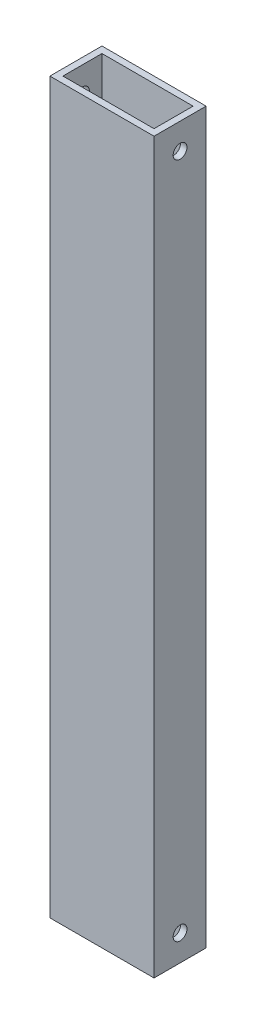
ISO-10303-21;
HEADER;
FILE_DESCRIPTION(('STEP AP214'),'2;1');
FILE_NAME('part.step','',(''),(''),'','','');
FILE_SCHEMA(('AUTOMOTIVE_DESIGN { 1 0 10303 214 1 1 1 1 }'));
ENDSEC;
DATA;
#1=APPLICATION_CONTEXT('core data for automotive mechanical design processes');
#2=APPLICATION_PROTOCOL_DEFINITION('international standard','automotive_design',2000,#1);
#3=PRODUCT_CONTEXT('',#1,'mechanical');
#4=PRODUCT('Part','Part','',(#3));
#5=PRODUCT_RELATED_PRODUCT_CATEGORY('part','',(#4));
#6=PRODUCT_DEFINITION_FORMATION('','',#4);
#7=PRODUCT_DEFINITION_CONTEXT('part definition',#1,'design');
#8=PRODUCT_DEFINITION('design','',#6,#7);
#9=PRODUCT_DEFINITION_SHAPE('','',#8);
#10=(LENGTH_UNIT() NAMED_UNIT(*) SI_UNIT(.MILLI.,.METRE.));
#11=(NAMED_UNIT(*) PLANE_ANGLE_UNIT() SI_UNIT($,.RADIAN.));
#12=(NAMED_UNIT(*) SI_UNIT($,.STERADIAN.) SOLID_ANGLE_UNIT());
#13=UNCERTAINTY_MEASURE_WITH_UNIT(LENGTH_MEASURE(1.E-05),#10,'distance_accuracy_value','');
#14=(GEOMETRIC_REPRESENTATION_CONTEXT(3) GLOBAL_UNCERTAINTY_ASSIGNED_CONTEXT((#13)) GLOBAL_UNIT_ASSIGNED_CONTEXT((#10,
#11,#12)) REPRESENTATION_CONTEXT('',''));
#15=CARTESIAN_POINT('',(0.,0.,0.));
#16=DIRECTION('',(0.,0.,1.));
#17=DIRECTION('',(1.,0.,0.));
#18=AXIS2_PLACEMENT_3D('',#15,#16,#17);
#19=CARTESIAN_POINT('',(0.,355.6,0.));
#20=DIRECTION('',(0.,-1.,0.));
#21=DIRECTION('',(0.,0.,-1.));
#22=AXIS2_PLACEMENT_3D('',#19,#20,#21);
#23=PLANE('',#22);
#24=DIRECTION('',(0.,0.,1.));
#25=VECTOR('',#24,1.);
#26=CARTESIAN_POINT('',(0.,355.6,0.));
#27=LINE('',#26,#25);
#28=CARTESIAN_POINT('',(0.,355.6,-25.4));
#29=VERTEX_POINT('',#28);
#30=CARTESIAN_POINT('',(0.,355.6,0.));
#31=VERTEX_POINT('',#30);
#32=EDGE_CURVE('E137',#29,#31,#27,.T.);
#33=ORIENTED_EDGE('',*,*,#32,.T.);
#34=DIRECTION('',(1.,0.,0.));
#35=VECTOR('',#34,1.);
#36=CARTESIAN_POINT('',(0.,355.6,0.));
#37=LINE('',#36,#35);
#38=CARTESIAN_POINT('',(50.8,355.6,0.));
#39=VERTEX_POINT('',#38);
#40=EDGE_CURVE('E140',#31,#39,#37,.T.);
#41=ORIENTED_EDGE('',*,*,#40,.T.);
#42=DIRECTION('',(0.,0.,-1.));
#43=VECTOR('',#42,1.);
#44=CARTESIAN_POINT('',(50.8,355.6,0.));
#45=LINE('',#44,#43);
#46=CARTESIAN_POINT('',(50.8,355.6,-25.4));
#47=VERTEX_POINT('',#46);
#48=EDGE_CURVE('E143',#39,#47,#45,.T.);
#49=ORIENTED_EDGE('',*,*,#48,.T.);
#50=DIRECTION('',(-1.,0.,0.));
#51=VECTOR('',#50,1.);
#52=CARTESIAN_POINT('',(0.,355.6,-25.4));
#53=LINE('',#52,#51);
#54=EDGE_CURVE('E145',#47,#29,#53,.T.);
#55=ORIENTED_EDGE('',*,*,#54,.T.);
#56=EDGE_LOOP('',(#33,#41,#49,#55));
#57=FACE_BOUND('',#56,.T.);
#58=DIRECTION('',(1.,0.,0.));
#59=VECTOR('',#58,1.);
#60=CARTESIAN_POINT('',(3.175,355.6,-3.175));
#61=LINE('',#60,#59);
#62=CARTESIAN_POINT('',(3.175,355.6,-3.175));
#63=VERTEX_POINT('',#62);
#64=CARTESIAN_POINT('',(47.625,355.6,-3.175));
#65=VERTEX_POINT('',#64);
#66=EDGE_CURVE('E99',#63,#65,#61,.T.);
#67=ORIENTED_EDGE('',*,*,#66,.F.);
#68=DIRECTION('',(0.,0.,1.));
#69=VECTOR('',#68,1.);
#70=CARTESIAN_POINT('',(3.175,355.6,-3.175));
#71=LINE('',#70,#69);
#72=CARTESIAN_POINT('',(3.175,355.6,-22.225));
#73=VERTEX_POINT('',#72);
#74=EDGE_CURVE('E121',#73,#63,#71,.T.);
#75=ORIENTED_EDGE('',*,*,#74,.F.);
#76=DIRECTION('',(-1.,0.,0.));
#77=VECTOR('',#76,1.);
#78=CARTESIAN_POINT('',(3.175,355.6,-22.225));
#79=LINE('',#78,#77);
#80=CARTESIAN_POINT('',(47.625,355.6,-22.225));
#81=VERTEX_POINT('',#80);
#82=EDGE_CURVE('E119',#81,#73,#79,.T.);
#83=ORIENTED_EDGE('',*,*,#82,.F.);
#84=DIRECTION('',(0.,0.,-1.));
#85=VECTOR('',#84,1.);
#86=CARTESIAN_POINT('',(47.625,355.6,-3.175));
#87=LINE('',#86,#85);
#88=EDGE_CURVE('E107',#65,#81,#87,.T.);
#89=ORIENTED_EDGE('',*,*,#88,.F.);
#90=EDGE_LOOP('',(#67,#75,#83,#89));
#91=FACE_BOUND('',#90,.T.);
#92=ADVANCED_FACE('F32',(#57,#91),#23,.F.);
#93=CARTESIAN_POINT('',(0.,0.,0.));
#94=DIRECTION('',(0.,-1.,0.));
#95=DIRECTION('',(0.,0.,-1.));
#96=AXIS2_PLACEMENT_3D('',#93,#94,#95);
#97=PLANE('',#96);
#98=DIRECTION('',(0.,0.,1.));
#99=VECTOR('',#98,1.);
#100=CARTESIAN_POINT('',(0.,0.,0.));
#101=LINE('',#100,#99);
#102=CARTESIAN_POINT('',(0.,0.,-25.4));
#103=VERTEX_POINT('',#102);
#104=CARTESIAN_POINT('',(0.,0.,0.));
#105=VERTEX_POINT('',#104);
#106=EDGE_CURVE('E115',#103,#105,#101,.T.);
#107=ORIENTED_EDGE('',*,*,#106,.F.);
#108=DIRECTION('',(-1.,0.,0.));
#109=VECTOR('',#108,1.);
#110=CARTESIAN_POINT('',(0.,0.,-25.4));
#111=LINE('',#110,#109);
#112=CARTESIAN_POINT('',(50.8,0.,-25.4));
#113=VERTEX_POINT('',#112);
#114=EDGE_CURVE('E141',#113,#103,#111,.T.);
#115=ORIENTED_EDGE('',*,*,#114,.F.);
#116=DIRECTION('',(0.,0.,-1.));
#117=VECTOR('',#116,1.);
#118=CARTESIAN_POINT('',(50.8,0.,0.));
#119=LINE('',#118,#117);
#120=CARTESIAN_POINT('',(50.8,0.,0.));
#121=VERTEX_POINT('',#120);
#122=EDGE_CURVE('E152',#121,#113,#119,.T.);
#123=ORIENTED_EDGE('',*,*,#122,.F.);
#124=DIRECTION('',(1.,0.,0.));
#125=VECTOR('',#124,1.);
#126=CARTESIAN_POINT('',(0.,0.,0.));
#127=LINE('',#126,#125);
#128=EDGE_CURVE('E150',#105,#121,#127,.T.);
#129=ORIENTED_EDGE('',*,*,#128,.F.);
#130=EDGE_LOOP('',(#107,#115,#123,#129));
#131=FACE_BOUND('',#130,.T.);
#132=DIRECTION('',(0.,0.,1.));
#133=VECTOR('',#132,1.);
#134=CARTESIAN_POINT('',(3.175,0.,-3.175));
#135=LINE('',#134,#133);
#136=CARTESIAN_POINT('',(3.175,0.,-22.225));
#137=VERTEX_POINT('',#136);
#138=CARTESIAN_POINT('',(3.175,0.,-3.175));
#139=VERTEX_POINT('',#138);
#140=EDGE_CURVE('E108',#137,#139,#135,.T.);
#141=ORIENTED_EDGE('',*,*,#140,.T.);
#142=DIRECTION('',(1.,0.,0.));
#143=VECTOR('',#142,1.);
#144=CARTESIAN_POINT('',(3.175,0.,-3.175));
#145=LINE('',#144,#143);
#146=CARTESIAN_POINT('',(47.625,0.,-3.175));
#147=VERTEX_POINT('',#146);
#148=EDGE_CURVE('E57',#139,#147,#145,.T.);
#149=ORIENTED_EDGE('',*,*,#148,.T.);
#150=DIRECTION('',(0.,0.,-1.));
#151=VECTOR('',#150,1.);
#152=CARTESIAN_POINT('',(47.625,0.,-3.175));
#153=LINE('',#152,#151);
#154=CARTESIAN_POINT('',(47.625,0.,-22.225));
#155=VERTEX_POINT('',#154);
#156=EDGE_CURVE('E114',#147,#155,#153,.T.);
#157=ORIENTED_EDGE('',*,*,#156,.T.);
#158=DIRECTION('',(-1.,0.,0.));
#159=VECTOR('',#158,1.);
#160=CARTESIAN_POINT('',(3.175,0.,-22.225));
#161=LINE('',#160,#159);
#162=EDGE_CURVE('E129',#155,#137,#161,.T.);
#163=ORIENTED_EDGE('',*,*,#162,.T.);
#164=EDGE_LOOP('',(#141,#149,#157,#163));
#165=FACE_BOUND('',#164,.T.);
#166=ADVANCED_FACE('F205',(#131,#165),#97,.T.);
#167=CARTESIAN_POINT('',(0.,355.6,0.));
#168=DIRECTION('',(1.,0.,0.));
#169=DIRECTION('',(0.,0.,-1.));
#170=AXIS2_PLACEMENT_3D('',#167,#168,#169);
#171=PLANE('',#170);
#172=CARTESIAN_POINT('',(0.,342.9,-12.6999999999999));
#173=DIRECTION('',(-1.,0.,0.));
#174=DIRECTION('',(0.,0.,-1.));
#175=AXIS2_PLACEMENT_3D('',#172,#173,#174);
#176=CIRCLE('',#175,3.3734375);
#177=CARTESIAN_POINT('',(0.,342.9,-16.0734374999999));
#178=VERTEX_POINT('',#177);
#179=EDGE_CURVE('E181',#178,#178,#176,.T.);
#180=ORIENTED_EDGE('',*,*,#179,.F.);
#181=EDGE_LOOP('',(#180));
#182=FACE_BOUND('',#181,.T.);
#183=CARTESIAN_POINT('',(0.,12.7,-12.6999999999999));
#184=DIRECTION('',(1.,0.,0.));
#185=DIRECTION('',(0.,0.,-1.));
#186=AXIS2_PLACEMENT_3D('',#183,#184,#185);
#187=CIRCLE('',#186,3.3734375);
#188=CARTESIAN_POINT('',(0.,12.7,-16.0734374999999));
#189=VERTEX_POINT('',#188);
#190=EDGE_CURVE('E163',#189,#189,#187,.T.);
#191=ORIENTED_EDGE('',*,*,#190,.T.);
#192=EDGE_LOOP('',(#191));
#193=FACE_BOUND('',#192,.T.);
#194=ORIENTED_EDGE('',*,*,#106,.T.);
#195=DIRECTION('',(0.,-1.,0.));
#196=VECTOR('',#195,1.);
#197=CARTESIAN_POINT('',(0.,355.6,0.));
#198=LINE('',#197,#196);
#199=EDGE_CURVE('E11',#31,#105,#198,.T.);
#200=ORIENTED_EDGE('',*,*,#199,.F.);
#201=ORIENTED_EDGE('',*,*,#32,.F.);
#202=DIRECTION('',(0.,-1.,0.));
#203=VECTOR('',#202,1.);
#204=CARTESIAN_POINT('',(0.,355.6,-25.4));
#205=LINE('',#204,#203);
#206=EDGE_CURVE('E147',#29,#103,#205,.T.);
#207=ORIENTED_EDGE('',*,*,#206,.T.);
#208=EDGE_LOOP('',(#194,#200,#201,#207));
#209=FACE_BOUND('',#208,.T.);
#210=ADVANCED_FACE('F34',(#182,#193,#209),#171,.F.);
#211=CARTESIAN_POINT('',(0.,355.6,0.));
#212=DIRECTION('',(0.,0.,-1.));
#213=DIRECTION('',(-1.,0.,0.));
#214=AXIS2_PLACEMENT_3D('',#211,#212,#213);
#215=PLANE('',#214);
#216=ORIENTED_EDGE('',*,*,#128,.T.);
#217=DIRECTION('',(0.,-1.,0.));
#218=VECTOR('',#217,1.);
#219=CARTESIAN_POINT('',(50.8,355.6,0.));
#220=LINE('',#219,#218);
#221=EDGE_CURVE('E41',#39,#121,#220,.T.);
#222=ORIENTED_EDGE('',*,*,#221,.F.);
#223=ORIENTED_EDGE('',*,*,#40,.F.);
#224=ORIENTED_EDGE('',*,*,#199,.T.);
#225=EDGE_LOOP('',(#216,#222,#223,#224));
#226=FACE_BOUND('',#225,.T.);
#227=ADVANCED_FACE('F222',(#226),#215,.F.);
#228=CARTESIAN_POINT('',(50.8,355.6,0.));
#229=DIRECTION('',(-1.,0.,0.));
#230=DIRECTION('',(0.,0.,1.));
#231=AXIS2_PLACEMENT_3D('',#228,#229,#230);
#232=PLANE('',#231);
#233=CARTESIAN_POINT('',(50.8,342.9,-12.7));
#234=DIRECTION('',(-1.,0.,0.));
#235=DIRECTION('',(0.,0.,-1.));
#236=AXIS2_PLACEMENT_3D('',#233,#234,#235);
#237=CIRCLE('',#236,3.3734375);
#238=CARTESIAN_POINT('',(50.8,342.9,-16.0734375));
#239=VERTEX_POINT('',#238);
#240=EDGE_CURVE('E178',#239,#239,#237,.T.);
#241=ORIENTED_EDGE('',*,*,#240,.T.);
#242=EDGE_LOOP('',(#241));
#243=FACE_BOUND('',#242,.T.);
#244=CARTESIAN_POINT('',(50.8,12.7,-12.7));
#245=DIRECTION('',(1.,0.,0.));
#246=DIRECTION('',(0.,0.,-1.));
#247=AXIS2_PLACEMENT_3D('',#244,#245,#246);
#248=CIRCLE('',#247,3.3734375);
#249=CARTESIAN_POINT('',(50.8,12.7,-16.0734375));
#250=VERTEX_POINT('',#249);
#251=EDGE_CURVE('E168',#250,#250,#248,.T.);
#252=ORIENTED_EDGE('',*,*,#251,.F.);
#253=EDGE_LOOP('',(#252));
#254=FACE_BOUND('',#253,.T.);
#255=ORIENTED_EDGE('',*,*,#122,.T.);
#256=DIRECTION('',(0.,-1.,0.));
#257=VECTOR('',#256,1.);
#258=CARTESIAN_POINT('',(50.8,355.6,-25.4));
#259=LINE('',#258,#257);
#260=EDGE_CURVE('E157',#47,#113,#259,.T.);
#261=ORIENTED_EDGE('',*,*,#260,.F.);
#262=ORIENTED_EDGE('',*,*,#48,.F.);
#263=ORIENTED_EDGE('',*,*,#221,.T.);
#264=EDGE_LOOP('',(#255,#261,#262,#263));
#265=FACE_BOUND('',#264,.T.);
#266=ADVANCED_FACE('F219',(#243,#254,#265),#232,.F.);
#267=CARTESIAN_POINT('',(0.,355.6,-25.4));
#268=DIRECTION('',(0.,0.,1.));
#269=DIRECTION('',(1.,0.,0.));
#270=AXIS2_PLACEMENT_3D('',#267,#268,#269);
#271=PLANE('',#270);
#272=ORIENTED_EDGE('',*,*,#114,.T.);
#273=ORIENTED_EDGE('',*,*,#206,.F.);
#274=ORIENTED_EDGE('',*,*,#54,.F.);
#275=ORIENTED_EDGE('',*,*,#260,.T.);
#276=EDGE_LOOP('',(#272,#273,#274,#275));
#277=FACE_BOUND('',#276,.T.);
#278=ADVANCED_FACE('F216',(#277),#271,.F.);
#279=CARTESIAN_POINT('',(3.175,355.6,-3.175));
#280=DIRECTION('',(0.,0.,-1.));
#281=DIRECTION('',(-1.,0.,0.));
#282=AXIS2_PLACEMENT_3D('',#279,#280,#281);
#283=PLANE('',#282);
#284=ORIENTED_EDGE('',*,*,#148,.F.);
#285=DIRECTION('',(0.,-1.,0.));
#286=VECTOR('',#285,1.);
#287=CARTESIAN_POINT('',(3.175,355.6,-3.175));
#288=LINE('',#287,#286);
#289=EDGE_CURVE('E103',#63,#139,#288,.T.);
#290=ORIENTED_EDGE('',*,*,#289,.F.);
#291=ORIENTED_EDGE('',*,*,#66,.T.);
#292=DIRECTION('',(0.,-1.,0.));
#293=VECTOR('',#292,1.);
#294=CARTESIAN_POINT('',(47.625,355.6,-3.175));
#295=LINE('',#294,#293);
#296=EDGE_CURVE('E102',#65,#147,#295,.T.);
#297=ORIENTED_EDGE('',*,*,#296,.T.);
#298=EDGE_LOOP('',(#284,#290,#291,#297));
#299=FACE_BOUND('',#298,.T.);
#300=ADVANCED_FACE('F101',(#299),#283,.T.);
#301=CARTESIAN_POINT('',(47.625,355.6,-3.175));
#302=DIRECTION('',(-1.,0.,0.));
#303=DIRECTION('',(0.,0.,1.));
#304=AXIS2_PLACEMENT_3D('',#301,#302,#303);
#305=PLANE('',#304);
#306=CARTESIAN_POINT('',(47.625,342.9,-12.7));
#307=DIRECTION('',(-1.,0.,0.));
#308=DIRECTION('',(0.,0.,1.));
#309=AXIS2_PLACEMENT_3D('',#306,#307,#308);
#310=CIRCLE('',#309,3.3734375);
#311=CARTESIAN_POINT('',(47.625,342.9,-9.32656249999997));
#312=VERTEX_POINT('',#311);
#313=EDGE_CURVE('E173',#312,#312,#310,.F.);
#314=ORIENTED_EDGE('',*,*,#313,.T.);
#315=EDGE_LOOP('',(#314));
#316=FACE_BOUND('',#315,.T.);
#317=CARTESIAN_POINT('',(47.625,12.7,-12.7));
#318=DIRECTION('',(-1.,0.,0.));
#319=DIRECTION('',(0.,0.,1.));
#320=AXIS2_PLACEMENT_3D('',#317,#318,#319);
#321=CIRCLE('',#320,3.3734375);
#322=CARTESIAN_POINT('',(47.625,12.7,-9.32656249999997));
#323=VERTEX_POINT('',#322);
#324=EDGE_CURVE('E127',#323,#323,#321,.T.);
#325=ORIENTED_EDGE('',*,*,#324,.F.);
#326=EDGE_LOOP('',(#325));
#327=FACE_BOUND('',#326,.T.);
#328=ORIENTED_EDGE('',*,*,#156,.F.);
#329=ORIENTED_EDGE('',*,*,#296,.F.);
#330=ORIENTED_EDGE('',*,*,#88,.T.);
#331=DIRECTION('',(0.,-1.,0.));
#332=VECTOR('',#331,1.);
#333=CARTESIAN_POINT('',(47.625,355.6,-22.225));
#334=LINE('',#333,#332);
#335=EDGE_CURVE('E116',#81,#155,#334,.T.);
#336=ORIENTED_EDGE('',*,*,#335,.T.);
#337=EDGE_LOOP('',(#328,#329,#330,#336));
#338=FACE_BOUND('',#337,.T.);
#339=ADVANCED_FACE('F111',(#316,#327,#338),#305,.T.);
#340=CARTESIAN_POINT('',(3.175,355.6,-22.225));
#341=DIRECTION('',(0.,0.,1.));
#342=DIRECTION('',(1.,0.,0.));
#343=AXIS2_PLACEMENT_3D('',#340,#341,#342);
#344=PLANE('',#343);
#345=ORIENTED_EDGE('',*,*,#162,.F.);
#346=ORIENTED_EDGE('',*,*,#335,.F.);
#347=ORIENTED_EDGE('',*,*,#82,.T.);
#348=DIRECTION('',(0.,-1.,0.));
#349=VECTOR('',#348,1.);
#350=CARTESIAN_POINT('',(3.175,355.6,-22.225));
#351=LINE('',#350,#349);
#352=EDGE_CURVE('E49',#73,#137,#351,.T.);
#353=ORIENTED_EDGE('',*,*,#352,.T.);
#354=EDGE_LOOP('',(#345,#346,#347,#353));
#355=FACE_BOUND('',#354,.T.);
#356=ADVANCED_FACE('F245',(#355),#344,.T.);
#357=CARTESIAN_POINT('',(3.175,355.6,-3.175));
#358=DIRECTION('',(1.,0.,0.));
#359=DIRECTION('',(0.,0.,-1.));
#360=AXIS2_PLACEMENT_3D('',#357,#358,#359);
#361=PLANE('',#360);
#362=CARTESIAN_POINT('',(3.175,342.9,-12.6999999999999));
#363=DIRECTION('',(1.,0.,0.));
#364=DIRECTION('',(0.,0.,-1.));
#365=AXIS2_PLACEMENT_3D('',#362,#363,#364);
#366=CIRCLE('',#365,3.3734375);
#367=CARTESIAN_POINT('',(3.175,342.9,-16.0734374999999));
#368=VERTEX_POINT('',#367);
#369=EDGE_CURVE('E36',#368,#368,#366,.F.);
#370=ORIENTED_EDGE('',*,*,#369,.T.);
#371=EDGE_LOOP('',(#370));
#372=FACE_BOUND('',#371,.T.);
#373=CARTESIAN_POINT('',(3.175,12.7,-12.6999999999999));
#374=DIRECTION('',(1.,0.,0.));
#375=DIRECTION('',(0.,0.,-1.));
#376=AXIS2_PLACEMENT_3D('',#373,#374,#375);
#377=CIRCLE('',#376,3.3734375);
#378=CARTESIAN_POINT('',(3.175,12.7,-16.0734374999999));
#379=VERTEX_POINT('',#378);
#380=EDGE_CURVE('E161',#379,#379,#377,.T.);
#381=ORIENTED_EDGE('',*,*,#380,.F.);
#382=EDGE_LOOP('',(#381));
#383=FACE_BOUND('',#382,.T.);
#384=ORIENTED_EDGE('',*,*,#140,.F.);
#385=ORIENTED_EDGE('',*,*,#352,.F.);
#386=ORIENTED_EDGE('',*,*,#74,.T.);
#387=ORIENTED_EDGE('',*,*,#289,.T.);
#388=EDGE_LOOP('',(#384,#385,#386,#387));
#389=FACE_BOUND('',#388,.T.);
#390=ADVANCED_FACE('F188',(#372,#383,#389),#361,.T.);
#391=CARTESIAN_POINT('',(0.,12.7,-12.6999999999999));
#392=DIRECTION('',(1.,0.,0.));
#393=DIRECTION('',(0.,0.,-1.));
#394=AXIS2_PLACEMENT_3D('',#391,#392,#393);
#395=CYLINDRICAL_SURFACE('',#394,3.3734375);
#396=ORIENTED_EDGE('',*,*,#380,.T.);
#397=EDGE_LOOP('',(#396));
#398=FACE_BOUND('',#397,.T.);
#399=ORIENTED_EDGE('',*,*,#190,.F.);
#400=EDGE_LOOP('',(#399));
#401=FACE_BOUND('',#400,.T.);
#402=ADVANCED_FACE('F201',(#398,#401),#395,.F.);
#403=ORIENTED_EDGE('',*,*,#324,.T.);
#404=EDGE_LOOP('',(#403));
#405=FACE_BOUND('',#404,.T.);
#406=ORIENTED_EDGE('',*,*,#251,.T.);
#407=EDGE_LOOP('',(#406));
#408=FACE_BOUND('',#407,.T.);
#409=ADVANCED_FACE('F194',(#405,#408),#395,.F.);
#410=CARTESIAN_POINT('',(0.,342.9,-12.6999999999999));
#411=DIRECTION('',(1.,0.,0.));
#412=DIRECTION('',(0.,0.,-1.));
#413=AXIS2_PLACEMENT_3D('',#410,#411,#412);
#414=CYLINDRICAL_SURFACE('',#413,3.3734375);
#415=ORIENTED_EDGE('',*,*,#369,.F.);
#416=EDGE_LOOP('',(#415));
#417=FACE_BOUND('',#416,.T.);
#418=ORIENTED_EDGE('',*,*,#179,.T.);
#419=EDGE_LOOP('',(#418));
#420=FACE_BOUND('',#419,.T.);
#421=ADVANCED_FACE('F191',(#417,#420),#414,.F.);
#422=ORIENTED_EDGE('',*,*,#313,.F.);
#423=EDGE_LOOP('',(#422));
#424=FACE_BOUND('',#423,.T.);
#425=ORIENTED_EDGE('',*,*,#240,.F.);
#426=EDGE_LOOP('',(#425));
#427=FACE_BOUND('',#426,.T.);
#428=ADVANCED_FACE('F193',(#424,#427),#414,.F.);
#429=CLOSED_SHELL('',(#92,#166,#210,#227,#266,#278,#300,#339,#356,#390,#402,#409,#421,#428));
#430=MANIFOLD_SOLID_BREP('B2',#429);
#431=ADVANCED_BREP_SHAPE_REPRESENTATION('',(#18,#430),#14);
#432=SHAPE_DEFINITION_REPRESENTATION(#9,#431);
ENDSEC;
END-ISO-10303-21;
